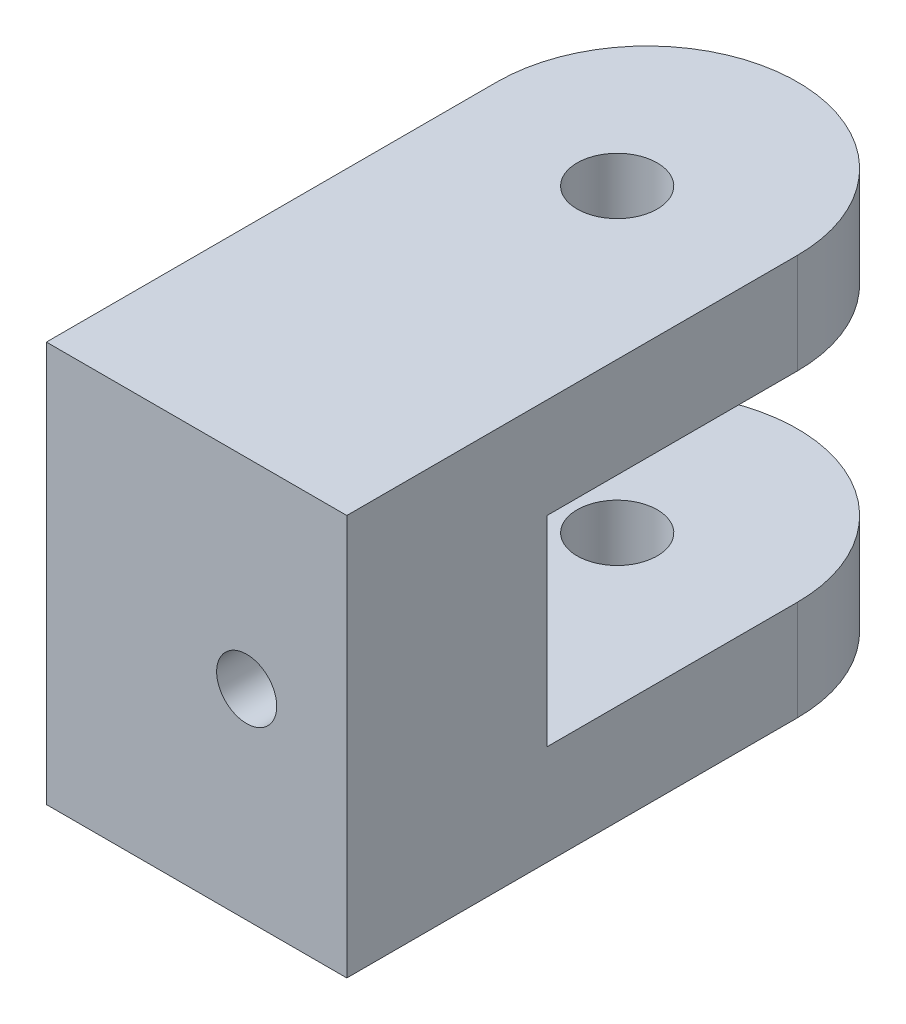
ISO-10303-21;
HEADER;
FILE_DESCRIPTION(('STEP AP214'),'2;1');
FILE_NAME('part.step','',(''),(''),'','','');
FILE_SCHEMA(('AUTOMOTIVE_DESIGN { 1 0 10303 214 1 1 1 1 }'));
ENDSEC;
DATA;
#1=APPLICATION_CONTEXT('core data for automotive mechanical design processes');
#2=APPLICATION_PROTOCOL_DEFINITION('international standard','automotive_design',2000,#1);
#3=PRODUCT_CONTEXT('',#1,'mechanical');
#4=PRODUCT('Part','Part','',(#3));
#5=PRODUCT_RELATED_PRODUCT_CATEGORY('part','',(#4));
#6=PRODUCT_DEFINITION_FORMATION('','',#4);
#7=PRODUCT_DEFINITION_CONTEXT('part definition',#1,'design');
#8=PRODUCT_DEFINITION('design','',#6,#7);
#9=PRODUCT_DEFINITION_SHAPE('','',#8);
#10=(LENGTH_UNIT() NAMED_UNIT(*) SI_UNIT(.MILLI.,.METRE.));
#11=(NAMED_UNIT(*) PLANE_ANGLE_UNIT() SI_UNIT($,.RADIAN.));
#12=(NAMED_UNIT(*) SI_UNIT($,.STERADIAN.) SOLID_ANGLE_UNIT());
#13=UNCERTAINTY_MEASURE_WITH_UNIT(LENGTH_MEASURE(1.E-05),#10,'distance_accuracy_value','');
#14=(GEOMETRIC_REPRESENTATION_CONTEXT(3) GLOBAL_UNCERTAINTY_ASSIGNED_CONTEXT((#13)) GLOBAL_UNIT_ASSIGNED_CONTEXT((#10,
#11,#12)) REPRESENTATION_CONTEXT('',''));
#15=CARTESIAN_POINT('',(0.,0.,0.));
#16=DIRECTION('',(0.,0.,1.));
#17=DIRECTION('',(1.,0.,0.));
#18=AXIS2_PLACEMENT_3D('',#15,#16,#17);
#19=CARTESIAN_POINT('',(7.5,0.,-12.5));
#20=DIRECTION('',(0.,-1.,0.));
#21=DIRECTION('',(0.,0.,-1.));
#22=AXIS2_PLACEMENT_3D('',#19,#20,#21);
#23=CYLINDRICAL_SURFACE('',#22,7.5);
#24=DIRECTION('',(0.,1.,0.));
#25=VECTOR('',#24,1.);
#26=CARTESIAN_POINT('',(15.,0.,-12.5));
#27=LINE('',#26,#25);
#28=CARTESIAN_POINT('',(15.,0.,-12.5));
#29=VERTEX_POINT('',#28);
#30=CARTESIAN_POINT('',(15.,5.,-12.5));
#31=VERTEX_POINT('',#30);
#32=EDGE_CURVE('E184',#29,#31,#27,.T.);
#33=ORIENTED_EDGE('',*,*,#32,.F.);
#34=CARTESIAN_POINT('',(7.5,0.,-12.5));
#35=DIRECTION('',(0.,1.,0.));
#36=DIRECTION('',(0.,0.,1.));
#37=AXIS2_PLACEMENT_3D('',#34,#35,#36);
#38=CIRCLE('',#37,7.5);
#39=CARTESIAN_POINT('',(0.,0.,-12.5));
#40=VERTEX_POINT('',#39);
#41=EDGE_CURVE('E53',#40,#29,#38,.F.);
#42=ORIENTED_EDGE('',*,*,#41,.F.);
#43=DIRECTION('',(0.,1.,0.));
#44=VECTOR('',#43,1.);
#45=CARTESIAN_POINT('',(0.,0.,-12.5));
#46=LINE('',#45,#44);
#47=CARTESIAN_POINT('',(0.,5.,-12.5));
#48=VERTEX_POINT('',#47);
#49=EDGE_CURVE('E187',#48,#40,#46,.F.);
#50=ORIENTED_EDGE('',*,*,#49,.F.);
#51=CARTESIAN_POINT('',(7.5,5.,-12.5));
#52=DIRECTION('',(0.,-1.,0.));
#53=DIRECTION('',(0.,0.,-1.));
#54=AXIS2_PLACEMENT_3D('',#51,#52,#53);
#55=CIRCLE('',#54,7.5);
#56=EDGE_CURVE('E11',#31,#48,#55,.F.);
#57=ORIENTED_EDGE('',*,*,#56,.F.);
#58=EDGE_LOOP('',(#33,#42,#50,#57));
#59=FACE_BOUND('',#58,.T.);
#60=ADVANCED_FACE('F44',(#59),#23,.T.);
#61=CARTESIAN_POINT('',(7.5,15.,-12.5));
#62=DIRECTION('',(0.,-1.,0.));
#63=DIRECTION('',(0.,0.,-1.));
#64=AXIS2_PLACEMENT_3D('',#61,#62,#63);
#65=CYLINDRICAL_SURFACE('',#64,7.5);
#66=DIRECTION('',(0.,1.,0.));
#67=VECTOR('',#66,1.);
#68=CARTESIAN_POINT('',(15.,15.,-12.5));
#69=LINE('',#68,#67);
#70=CARTESIAN_POINT('',(15.,15.,-12.5));
#71=VERTEX_POINT('',#70);
#72=CARTESIAN_POINT('',(15.,20.,-12.5));
#73=VERTEX_POINT('',#72);
#74=EDGE_CURVE('E172',#71,#73,#69,.T.);
#75=ORIENTED_EDGE('',*,*,#74,.F.);
#76=CARTESIAN_POINT('',(7.5,15.,-12.5));
#77=DIRECTION('',(0.,1.,0.));
#78=DIRECTION('',(0.,0.,1.));
#79=AXIS2_PLACEMENT_3D('',#76,#77,#78);
#80=CIRCLE('',#79,7.5);
#81=CARTESIAN_POINT('',(0.,15.,-12.5));
#82=VERTEX_POINT('',#81);
#83=EDGE_CURVE('E176',#82,#71,#80,.F.);
#84=ORIENTED_EDGE('',*,*,#83,.F.);
#85=DIRECTION('',(0.,1.,0.));
#86=VECTOR('',#85,1.);
#87=CARTESIAN_POINT('',(0.,15.,-12.5));
#88=LINE('',#87,#86);
#89=CARTESIAN_POINT('',(0.,20.,-12.5));
#90=VERTEX_POINT('',#89);
#91=EDGE_CURVE('E119',#90,#82,#88,.F.);
#92=ORIENTED_EDGE('',*,*,#91,.F.);
#93=CARTESIAN_POINT('',(7.5,20.,-12.5));
#94=DIRECTION('',(0.,-1.,0.));
#95=DIRECTION('',(0.,0.,-1.));
#96=AXIS2_PLACEMENT_3D('',#93,#94,#95);
#97=CIRCLE('',#96,7.5);
#98=EDGE_CURVE('E185',#73,#90,#97,.F.);
#99=ORIENTED_EDGE('',*,*,#98,.F.);
#100=EDGE_LOOP('',(#75,#84,#92,#99));
#101=FACE_BOUND('',#100,.T.);
#102=ADVANCED_FACE('F211',(#101),#65,.T.);
#103=CARTESIAN_POINT('',(15.,0.,10.));
#104=DIRECTION('',(-1.,0.,0.));
#105=DIRECTION('',(0.,0.,1.));
#106=AXIS2_PLACEMENT_3D('',#103,#104,#105);
#107=PLANE('',#106);
#108=DIRECTION('',(0.,0.,-1.));
#109=VECTOR('',#108,1.);
#110=CARTESIAN_POINT('',(15.,0.,10.));
#111=LINE('',#110,#109);
#112=CARTESIAN_POINT('',(15.,0.,10.));
#113=VERTEX_POINT('',#112);
#114=EDGE_CURVE('E167',#113,#29,#111,.T.);
#115=ORIENTED_EDGE('',*,*,#114,.T.);
#116=ORIENTED_EDGE('',*,*,#32,.T.);
#117=DIRECTION('',(0.,0.,-1.));
#118=VECTOR('',#117,1.);
#119=CARTESIAN_POINT('',(15.,5.,-20.));
#120=LINE('',#119,#118);
#121=CARTESIAN_POINT('',(15.,5.,0.));
#122=VERTEX_POINT('',#121);
#123=EDGE_CURVE('E120',#122,#31,#120,.T.);
#124=ORIENTED_EDGE('',*,*,#123,.F.);
#125=DIRECTION('',(0.,-1.,0.));
#126=VECTOR('',#125,1.);
#127=CARTESIAN_POINT('',(15.,15.,0.));
#128=LINE('',#127,#126);
#129=CARTESIAN_POINT('',(15.,15.,0.));
#130=VERTEX_POINT('',#129);
#131=EDGE_CURVE('E136',#130,#122,#128,.T.);
#132=ORIENTED_EDGE('',*,*,#131,.F.);
#133=DIRECTION('',(0.,0.,1.));
#134=VECTOR('',#133,1.);
#135=CARTESIAN_POINT('',(15.,15.,-20.));
#136=LINE('',#135,#134);
#137=EDGE_CURVE('E130',#71,#130,#136,.T.);
#138=ORIENTED_EDGE('',*,*,#137,.F.);
#139=ORIENTED_EDGE('',*,*,#74,.T.);
#140=DIRECTION('',(0.,0.,-1.));
#141=VECTOR('',#140,1.);
#142=CARTESIAN_POINT('',(15.,20.,10.));
#143=LINE('',#142,#141);
#144=CARTESIAN_POINT('',(15.,20.,10.));
#145=VERTEX_POINT('',#144);
#146=EDGE_CURVE('E162',#145,#73,#143,.T.);
#147=ORIENTED_EDGE('',*,*,#146,.F.);
#148=DIRECTION('',(0.,1.,0.));
#149=VECTOR('',#148,1.);
#150=CARTESIAN_POINT('',(15.,0.,10.));
#151=LINE('',#150,#149);
#152=EDGE_CURVE('E160',#113,#145,#151,.T.);
#153=ORIENTED_EDGE('',*,*,#152,.F.);
#154=EDGE_LOOP('',(#115,#116,#124,#132,#138,#139,#147,#153));
#155=FACE_BOUND('',#154,.T.);
#156=ADVANCED_FACE('F197',(#155),#107,.F.);
#157=CARTESIAN_POINT('',(7.5,45.,-11.));
#158=DIRECTION('',(0.,-1.,0.));
#159=DIRECTION('',(0.,0.,-1.));
#160=AXIS2_PLACEMENT_3D('',#157,#158,#159);
#161=CYLINDRICAL_SURFACE('',#160,2.);
#162=CARTESIAN_POINT('',(7.5,5.,-11.));
#163=DIRECTION('',(0.,-1.,0.));
#164=DIRECTION('',(0.,0.,-1.));
#165=AXIS2_PLACEMENT_3D('',#162,#163,#164);
#166=CIRCLE('',#165,2.);
#167=CARTESIAN_POINT('',(7.5,5.00000000000001,-13.));
#168=VERTEX_POINT('',#167);
#169=EDGE_CURVE('E149',#168,#168,#166,.F.);
#170=CARTESIAN_POINT('',(7.5,0.,-11.));
#171=DIRECTION('',(0.,-1.,0.));
#172=DIRECTION('',(0.,0.,-1.));
#173=AXIS2_PLACEMENT_3D('',#170,#171,#172);
#174=CIRCLE('',#173,2.);
#175=CARTESIAN_POINT('',(7.5,0.,-13.));
#176=VERTEX_POINT('',#175);
#177=EDGE_CURVE('E144',#176,#176,#174,.T.);
#178=CARTESIAN_POINT('',(7.5,5.00000000000001,-13.));
#179=CARTESIAN_POINT('',(7.5,4.94791666666668,-13.));
#180=CARTESIAN_POINT('',(7.5,4.89583333333335,-13.));
#181=CARTESIAN_POINT('',(7.5,4.79166666666668,-13.));
#182=CARTESIAN_POINT('',(7.5,4.73958333333335,-13.));
#183=CARTESIAN_POINT('',(7.5,4.63541666666668,-13.));
#184=CARTESIAN_POINT('',(7.5,4.58333333333334,-13.));
#185=CARTESIAN_POINT('',(7.5,4.47916666666668,-13.));
#186=CARTESIAN_POINT('',(7.5,4.42708333333334,-13.));
#187=CARTESIAN_POINT('',(7.5,4.32291666666668,-13.));
#188=CARTESIAN_POINT('',(7.5,4.27083333333335,-13.));
#189=CARTESIAN_POINT('',(7.5,4.16666666666668,-13.));
#190=CARTESIAN_POINT('',(7.5,4.11458333333335,-13.));
#191=CARTESIAN_POINT('',(7.5,4.01041666666668,-13.));
#192=CARTESIAN_POINT('',(7.5,3.95833333333334,-13.));
#193=CARTESIAN_POINT('',(7.5,3.85416666666667,-13.));
#194=CARTESIAN_POINT('',(7.5,3.80208333333334,-13.));
#195=CARTESIAN_POINT('',(7.5,3.69791666666668,-13.));
#196=CARTESIAN_POINT('',(7.5,3.64583333333335,-13.));
#197=CARTESIAN_POINT('',(7.5,3.54166666666668,-13.));
#198=CARTESIAN_POINT('',(7.5,3.48958333333334,-13.));
#199=CARTESIAN_POINT('',(7.5,3.38541666666668,-13.));
#200=CARTESIAN_POINT('',(7.5,3.33333333333334,-13.));
#201=CARTESIAN_POINT('',(7.5,3.22916666666667,-13.));
#202=CARTESIAN_POINT('',(7.5,3.17708333333334,-13.));
#203=CARTESIAN_POINT('',(7.5,3.07291666666668,-13.));
#204=CARTESIAN_POINT('',(7.5,3.02083333333335,-13.));
#205=CARTESIAN_POINT('',(7.5,2.91666666666668,-13.));
#206=CARTESIAN_POINT('',(7.5,2.86458333333334,-13.));
#207=CARTESIAN_POINT('',(7.5,2.76041666666667,-13.));
#208=CARTESIAN_POINT('',(7.5,2.70833333333334,-13.));
#209=CARTESIAN_POINT('',(7.5,2.60416666666667,-13.));
#210=CARTESIAN_POINT('',(7.5,2.55208333333334,-13.));
#211=CARTESIAN_POINT('',(7.5,2.44791666666668,-13.));
#212=CARTESIAN_POINT('',(7.5,2.39583333333335,-13.));
#213=CARTESIAN_POINT('',(7.5,2.29166666666668,-13.));
#214=CARTESIAN_POINT('',(7.5,2.23958333333334,-13.));
#215=CARTESIAN_POINT('',(7.5,2.13541666666667,-13.));
#216=CARTESIAN_POINT('',(7.5,2.08333333333334,-13.));
#217=CARTESIAN_POINT('',(7.5,1.97916666666667,-13.));
#218=CARTESIAN_POINT('',(7.5,1.92708333333334,-13.));
#219=CARTESIAN_POINT('',(7.5,1.82291666666668,-13.));
#220=CARTESIAN_POINT('',(7.5,1.77083333333334,-13.));
#221=CARTESIAN_POINT('',(7.5,1.66666666666668,-13.));
#222=CARTESIAN_POINT('',(7.5,1.61458333333334,-13.));
#223=CARTESIAN_POINT('',(7.5,1.51041666666667,-13.));
#224=CARTESIAN_POINT('',(7.5,1.45833333333334,-13.));
#225=CARTESIAN_POINT('',(7.5,1.35416666666667,-13.));
#226=CARTESIAN_POINT('',(7.5,1.30208333333334,-13.));
#227=CARTESIAN_POINT('',(7.5,1.19791666666668,-13.));
#228=CARTESIAN_POINT('',(7.5,1.14583333333334,-13.));
#229=CARTESIAN_POINT('',(7.5,1.04166666666668,-13.));
#230=CARTESIAN_POINT('',(7.5,0.989583333333342,-13.));
#231=CARTESIAN_POINT('',(7.5,0.885416666666673,-13.));
#232=CARTESIAN_POINT('',(7.5,0.833333333333339,-13.));
#233=CARTESIAN_POINT('',(7.5,0.729166666666672,-13.));
#234=CARTESIAN_POINT('',(7.5,0.67708333333334,-13.));
#235=CARTESIAN_POINT('',(7.5,0.572916666666675,-13.));
#236=CARTESIAN_POINT('',(7.5,0.520833333333343,-13.));
#237=CARTESIAN_POINT('',(7.5,0.416666666666676,-13.));
#238=CARTESIAN_POINT('',(7.5,0.364583333333342,-13.));
#239=CARTESIAN_POINT('',(7.5,0.260416666666673,-13.));
#240=CARTESIAN_POINT('',(7.5,0.208333333333338,-13.));
#241=CARTESIAN_POINT('',(7.5,0.104166666666671,-13.));
#242=CARTESIAN_POINT('',(7.5,0.0520833333333391,-13.));
#243=CARTESIAN_POINT('',(7.5,0.,-13.));
#244=B_SPLINE_CURVE_WITH_KNOTS('',3,(#178,#179,#180,#181,#182,#183,#184,#185,#186,#187,#188,
#189,#190,#191,#192,#193,#194,#195,#196,#197,#198,#199,#200,#201,#202,#203,#204,#205,#206,#207,
#208,#209,#210,#211,#212,#213,#214,#215,#216,#217,#218,#219,#220,#221,#222,#223,#224,#225,#226,
#227,#228,#229,#230,#231,#232,#233,#234,#235,#236,#237,#238,#239,#240,#241,#242,#243),
.UNSPECIFIED.,.F.,.F.,(4,2,2,2,2,2,2,2,2,2,2,2,2,2,2,2,2,2,2,2,2,2,2,2,2,2,2,2,2,2,2,2,4),(0.,
0.156249999999997,0.3125,0.468750000000004,0.625000000000001,0.781249999999997,
0.937500000000001,1.09375,1.25,1.40625,1.5625,1.71875,1.875,2.03125,2.1875,2.34375000000001,2.5,
2.65625,2.8125,2.96875000000001,3.125,3.28125,3.4375,3.59375000000001,3.75,3.90625,4.0625,
4.21875000000001,4.375,4.53125,4.6875,4.84375000000001,5.),.UNSPECIFIED.);
#245=EDGE_CURVE('BSEAM217',#168,#176,#244,.T.);
#246=ORIENTED_EDGE('',*,*,#169,.T.);
#247=ORIENTED_EDGE('',*,*,#177,.T.);
#248=ORIENTED_EDGE('',*,*,#245,.T.);
#249=ORIENTED_EDGE('',*,*,#245,.F.);
#250=EDGE_LOOP('',(#246,#248,#247,#249));
#251=FACE_BOUND('',#250,.T.);
#252=ADVANCED_FACE('F217',(#251),#161,.F.);
#253=CARTESIAN_POINT('',(0.,0.,10.));
#254=DIRECTION('',(1.,0.,0.));
#255=DIRECTION('',(0.,0.,-1.));
#256=AXIS2_PLACEMENT_3D('',#253,#254,#255);
#257=PLANE('',#256);
#258=DIRECTION('',(0.,0.,-1.));
#259=VECTOR('',#258,1.);
#260=CARTESIAN_POINT('',(0.,5.,-20.));
#261=LINE('',#260,#259);
#262=CARTESIAN_POINT('',(0.,5.,0.));
#263=VERTEX_POINT('',#262);
#264=EDGE_CURVE('E132',#263,#48,#261,.T.);
#265=ORIENTED_EDGE('',*,*,#264,.T.);
#266=ORIENTED_EDGE('',*,*,#49,.T.);
#267=DIRECTION('',(0.,0.,-1.));
#268=VECTOR('',#267,1.);
#269=CARTESIAN_POINT('',(0.,0.,10.));
#270=LINE('',#269,#268);
#271=CARTESIAN_POINT('',(0.,0.,10.));
#272=VERTEX_POINT('',#271);
#273=EDGE_CURVE('E166',#272,#40,#270,.T.);
#274=ORIENTED_EDGE('',*,*,#273,.F.);
#275=DIRECTION('',(0.,-1.,0.));
#276=VECTOR('',#275,1.);
#277=CARTESIAN_POINT('',(0.,0.,10.));
#278=LINE('',#277,#276);
#279=CARTESIAN_POINT('',(0.,20.,10.));
#280=VERTEX_POINT('',#279);
#281=EDGE_CURVE('E155',#280,#272,#278,.T.);
#282=ORIENTED_EDGE('',*,*,#281,.F.);
#283=DIRECTION('',(0.,0.,-1.));
#284=VECTOR('',#283,1.);
#285=CARTESIAN_POINT('',(0.,20.,10.));
#286=LINE('',#285,#284);
#287=EDGE_CURVE('E161',#280,#90,#286,.T.);
#288=ORIENTED_EDGE('',*,*,#287,.T.);
#289=ORIENTED_EDGE('',*,*,#91,.T.);
#290=DIRECTION('',(0.,0.,1.));
#291=VECTOR('',#290,1.);
#292=CARTESIAN_POINT('',(0.,15.,-20.));
#293=LINE('',#292,#291);
#294=CARTESIAN_POINT('',(0.,15.,0.));
#295=VERTEX_POINT('',#294);
#296=EDGE_CURVE('E109',#82,#295,#293,.T.);
#297=ORIENTED_EDGE('',*,*,#296,.T.);
#298=DIRECTION('',(0.,-1.,0.));
#299=VECTOR('',#298,1.);
#300=CARTESIAN_POINT('',(0.,15.,0.));
#301=LINE('',#300,#299);
#302=EDGE_CURVE('E113',#295,#263,#301,.T.);
#303=ORIENTED_EDGE('',*,*,#302,.T.);
#304=EDGE_LOOP('',(#265,#266,#274,#282,#288,#289,#297,#303));
#305=FACE_BOUND('',#304,.T.);
#306=ADVANCED_FACE('F114',(#305),#257,.F.);
#307=CARTESIAN_POINT('',(0.,0.,10.));
#308=DIRECTION('',(0.,1.,0.));
#309=DIRECTION('',(0.,0.,1.));
#310=AXIS2_PLACEMENT_3D('',#307,#308,#309);
#311=PLANE('',#310);
#312=ORIENTED_EDGE('',*,*,#273,.T.);
#313=ORIENTED_EDGE('',*,*,#41,.T.);
#314=ORIENTED_EDGE('',*,*,#114,.F.);
#315=DIRECTION('',(1.,0.,0.));
#316=VECTOR('',#315,1.);
#317=CARTESIAN_POINT('',(0.,0.,10.));
#318=LINE('',#317,#316);
#319=EDGE_CURVE('E154',#272,#113,#318,.T.);
#320=ORIENTED_EDGE('',*,*,#319,.F.);
#321=EDGE_LOOP('',(#312,#313,#314,#320));
#322=FACE_BOUND('',#321,.T.);
#323=ORIENTED_EDGE('',*,*,#177,.F.);
#324=EDGE_LOOP('',(#323));
#325=FACE_BOUND('',#324,.T.);
#326=ADVANCED_FACE('F193',(#322,#325),#311,.F.);
#327=CARTESIAN_POINT('',(0.,20.,10.));
#328=DIRECTION('',(0.,-1.,0.));
#329=DIRECTION('',(0.,0.,-1.));
#330=AXIS2_PLACEMENT_3D('',#327,#328,#329);
#331=PLANE('',#330);
#332=ORIENTED_EDGE('',*,*,#146,.T.);
#333=ORIENTED_EDGE('',*,*,#98,.T.);
#334=ORIENTED_EDGE('',*,*,#287,.F.);
#335=DIRECTION('',(-1.,0.,0.));
#336=VECTOR('',#335,1.);
#337=CARTESIAN_POINT('',(0.,20.,10.));
#338=LINE('',#337,#336);
#339=EDGE_CURVE('E157',#145,#280,#338,.T.);
#340=ORIENTED_EDGE('',*,*,#339,.F.);
#341=EDGE_LOOP('',(#332,#333,#334,#340));
#342=FACE_BOUND('',#341,.T.);
#343=CARTESIAN_POINT('',(7.5,20.,-11.));
#344=DIRECTION('',(0.,-1.,0.));
#345=DIRECTION('',(0.,0.,-1.));
#346=AXIS2_PLACEMENT_3D('',#343,#344,#345);
#347=CIRCLE('',#346,2.);
#348=CARTESIAN_POINT('',(7.5,20.,-13.));
#349=VERTEX_POINT('',#348);
#350=EDGE_CURVE('E146',#349,#349,#347,.F.);
#351=ORIENTED_EDGE('',*,*,#350,.F.);
#352=EDGE_LOOP('',(#351));
#353=FACE_BOUND('',#352,.T.);
#354=ADVANCED_FACE('F207',(#342,#353),#331,.F.);
#355=CARTESIAN_POINT('',(0.,0.,10.));
#356=DIRECTION('',(0.,0.,-1.));
#357=DIRECTION('',(-1.,0.,0.));
#358=AXIS2_PLACEMENT_3D('',#355,#356,#357);
#359=PLANE('',#358);
#360=CARTESIAN_POINT('',(10.,10.,10.));
#361=DIRECTION('',(0.,0.,1.));
#362=DIRECTION('',(1.,0.,0.));
#363=AXIS2_PLACEMENT_3D('',#360,#361,#362);
#364=CIRCLE('',#363,1.5);
#365=CARTESIAN_POINT('',(11.5,10.,10.));
#366=VERTEX_POINT('',#365);
#367=EDGE_CURVE('E253',#366,#366,#364,.T.);
#368=ORIENTED_EDGE('',*,*,#367,.F.);
#369=EDGE_LOOP('',(#368));
#370=FACE_BOUND('',#369,.T.);
#371=ORIENTED_EDGE('',*,*,#281,.T.);
#372=ORIENTED_EDGE('',*,*,#319,.T.);
#373=ORIENTED_EDGE('',*,*,#152,.T.);
#374=ORIENTED_EDGE('',*,*,#339,.T.);
#375=EDGE_LOOP('',(#371,#372,#373,#374));
#376=FACE_BOUND('',#375,.T.);
#377=ADVANCED_FACE('F203',(#370,#376),#359,.F.);
#378=CARTESIAN_POINT('',(7.5,15.,-11.));
#379=DIRECTION('',(0.,1.,0.));
#380=DIRECTION('',(0.,0.,1.));
#381=AXIS2_PLACEMENT_3D('',#378,#379,#380);
#382=CIRCLE('',#381,2.);
#383=CARTESIAN_POINT('',(7.5,15.,-13.));
#384=VERTEX_POINT('',#383);
#385=EDGE_CURVE('E141',#384,#384,#382,.F.);
#386=CARTESIAN_POINT('',(7.5,15.,-13.));
#387=CARTESIAN_POINT('',(7.5,15.0520833333333,-13.));
#388=CARTESIAN_POINT('',(7.5,15.1041666666667,-13.));
#389=CARTESIAN_POINT('',(7.5,15.2083333333333,-13.));
#390=CARTESIAN_POINT('',(7.5,15.2604166666667,-13.));
#391=CARTESIAN_POINT('',(7.5,15.3645833333333,-13.));
#392=CARTESIAN_POINT('',(7.5,15.4166666666667,-13.));
#393=CARTESIAN_POINT('',(7.5,15.5208333333333,-13.));
#394=CARTESIAN_POINT('',(7.5,15.5729166666667,-13.));
#395=CARTESIAN_POINT('',(7.5,15.6770833333333,-13.));
#396=CARTESIAN_POINT('',(7.5,15.7291666666667,-13.));
#397=CARTESIAN_POINT('',(7.5,15.8333333333333,-13.));
#398=CARTESIAN_POINT('',(7.5,15.8854166666667,-13.));
#399=CARTESIAN_POINT('',(7.5,15.9895833333333,-13.));
#400=CARTESIAN_POINT('',(7.5,16.0416666666667,-13.));
#401=CARTESIAN_POINT('',(7.5,16.1458333333333,-13.));
#402=CARTESIAN_POINT('',(7.5,16.1979166666667,-13.));
#403=CARTESIAN_POINT('',(7.5,16.3020833333333,-13.));
#404=CARTESIAN_POINT('',(7.5,16.3541666666667,-13.));
#405=CARTESIAN_POINT('',(7.5,16.4583333333333,-13.));
#406=CARTESIAN_POINT('',(7.5,16.5104166666667,-13.));
#407=CARTESIAN_POINT('',(7.5,16.6145833333333,-13.));
#408=CARTESIAN_POINT('',(7.5,16.6666666666667,-13.));
#409=CARTESIAN_POINT('',(7.5,16.7708333333333,-13.));
#410=CARTESIAN_POINT('',(7.5,16.8229166666667,-13.));
#411=CARTESIAN_POINT('',(7.5,16.9270833333333,-13.));
#412=CARTESIAN_POINT('',(7.5,16.9791666666667,-13.));
#413=CARTESIAN_POINT('',(7.5,17.0833333333333,-13.));
#414=CARTESIAN_POINT('',(7.5,17.1354166666667,-13.));
#415=CARTESIAN_POINT('',(7.5,17.2395833333333,-13.));
#416=CARTESIAN_POINT('',(7.5,17.2916666666667,-13.));
#417=CARTESIAN_POINT('',(7.5,17.3958333333333,-13.));
#418=CARTESIAN_POINT('',(7.5,17.4479166666667,-13.));
#419=CARTESIAN_POINT('',(7.5,17.5520833333333,-13.));
#420=CARTESIAN_POINT('',(7.5,17.6041666666667,-13.));
#421=CARTESIAN_POINT('',(7.5,17.7083333333333,-13.));
#422=CARTESIAN_POINT('',(7.5,17.7604166666667,-13.));
#423=CARTESIAN_POINT('',(7.5,17.8645833333333,-13.));
#424=CARTESIAN_POINT('',(7.5,17.9166666666667,-13.));
#425=CARTESIAN_POINT('',(7.5,18.0208333333333,-13.));
#426=CARTESIAN_POINT('',(7.5,18.0729166666667,-13.));
#427=CARTESIAN_POINT('',(7.5,18.1770833333333,-13.));
#428=CARTESIAN_POINT('',(7.5,18.2291666666667,-13.));
#429=CARTESIAN_POINT('',(7.5,18.3333333333333,-13.));
#430=CARTESIAN_POINT('',(7.5,18.3854166666667,-13.));
#431=CARTESIAN_POINT('',(7.5,18.4895833333333,-13.));
#432=CARTESIAN_POINT('',(7.5,18.5416666666667,-13.));
#433=CARTESIAN_POINT('',(7.5,18.6458333333333,-13.));
#434=CARTESIAN_POINT('',(7.5,18.6979166666667,-13.));
#435=CARTESIAN_POINT('',(7.5,18.8020833333333,-13.));
#436=CARTESIAN_POINT('',(7.5,18.8541666666667,-13.));
#437=CARTESIAN_POINT('',(7.5,18.9583333333333,-13.));
#438=CARTESIAN_POINT('',(7.5,19.0104166666667,-13.));
#439=CARTESIAN_POINT('',(7.5,19.1145833333333,-13.));
#440=CARTESIAN_POINT('',(7.5,19.1666666666667,-13.));
#441=CARTESIAN_POINT('',(7.5,19.2708333333333,-13.));
#442=CARTESIAN_POINT('',(7.5,19.3229166666667,-13.));
#443=CARTESIAN_POINT('',(7.5,19.4270833333333,-13.));
#444=CARTESIAN_POINT('',(7.5,19.4791666666667,-13.));
#445=CARTESIAN_POINT('',(7.5,19.5833333333333,-13.));
#446=CARTESIAN_POINT('',(7.5,19.6354166666667,-13.));
#447=CARTESIAN_POINT('',(7.5,19.7395833333333,-13.));
#448=CARTESIAN_POINT('',(7.5,19.7916666666667,-13.));
#449=CARTESIAN_POINT('',(7.5,19.8958333333333,-13.));
#450=CARTESIAN_POINT('',(7.5,19.9479166666667,-13.));
#451=CARTESIAN_POINT('',(7.5,20.,-13.));
#452=B_SPLINE_CURVE_WITH_KNOTS('',3,(#386,#387,#388,#389,#390,#391,#392,#393,#394,#395,#396,
#397,#398,#399,#400,#401,#402,#403,#404,#405,#406,#407,#408,#409,#410,#411,#412,#413,#414,#415,
#416,#417,#418,#419,#420,#421,#422,#423,#424,#425,#426,#427,#428,#429,#430,#431,#432,#433,#434,
#435,#436,#437,#438,#439,#440,#441,#442,#443,#444,#445,#446,#447,#448,#449,#450,#451),
.UNSPECIFIED.,.F.,.F.,(4,2,2,2,2,2,2,2,2,2,2,2,2,2,2,2,2,2,2,2,2,2,2,2,2,2,2,2,2,2,2,2,4),(0.,
0.15625,0.3125,0.46875,0.625000000000001,0.781250000000001,0.937500000000001,1.09375,1.25,
1.40625,1.5625,1.71875,1.875,2.03125,2.1875,2.34375,2.5,2.65625,2.8125,2.96875,3.125,3.28125,
3.4375,3.59375,3.75,3.90625,4.0625,4.21875,4.375,4.53125,4.6875,4.84375,5.),.UNSPECIFIED.);
#453=EDGE_CURVE('BSEAM234',#384,#349,#452,.T.);
#454=ORIENTED_EDGE('',*,*,#385,.T.);
#455=ORIENTED_EDGE('',*,*,#350,.T.);
#456=ORIENTED_EDGE('',*,*,#453,.T.);
#457=ORIENTED_EDGE('',*,*,#453,.F.);
#458=EDGE_LOOP('',(#454,#456,#455,#457));
#459=FACE_BOUND('',#458,.T.);
#460=ADVANCED_FACE('F234',(#459),#161,.F.);
#461=CARTESIAN_POINT('',(0.,5.,-20.));
#462=DIRECTION('',(0.,-1.,0.));
#463=DIRECTION('',(0.,0.,-1.));
#464=AXIS2_PLACEMENT_3D('',#461,#462,#463);
#465=PLANE('',#464);
#466=ORIENTED_EDGE('',*,*,#123,.T.);
#467=ORIENTED_EDGE('',*,*,#56,.T.);
#468=ORIENTED_EDGE('',*,*,#264,.F.);
#469=DIRECTION('',(1.,0.,0.));
#470=VECTOR('',#469,1.);
#471=CARTESIAN_POINT('',(0.,5.,0.));
#472=LINE('',#471,#470);
#473=EDGE_CURVE('E131',#263,#122,#472,.T.);
#474=ORIENTED_EDGE('',*,*,#473,.T.);
#475=EDGE_LOOP('',(#466,#467,#468,#474));
#476=FACE_BOUND('',#475,.T.);
#477=ORIENTED_EDGE('',*,*,#169,.F.);
#478=EDGE_LOOP('',(#477));
#479=FACE_BOUND('',#478,.T.);
#480=ADVANCED_FACE('F204',(#476,#479),#465,.F.);
#481=CARTESIAN_POINT('',(0.,15.,-20.));
#482=DIRECTION('',(0.,1.,0.));
#483=DIRECTION('',(0.,0.,1.));
#484=AXIS2_PLACEMENT_3D('',#481,#482,#483);
#485=PLANE('',#484);
#486=ORIENTED_EDGE('',*,*,#296,.F.);
#487=ORIENTED_EDGE('',*,*,#83,.T.);
#488=ORIENTED_EDGE('',*,*,#137,.T.);
#489=DIRECTION('',(1.,0.,0.));
#490=VECTOR('',#489,1.);
#491=CARTESIAN_POINT('',(0.,15.,0.));
#492=LINE('',#491,#490);
#493=EDGE_CURVE('E122',#295,#130,#492,.T.);
#494=ORIENTED_EDGE('',*,*,#493,.F.);
#495=EDGE_LOOP('',(#486,#487,#488,#494));
#496=FACE_BOUND('',#495,.T.);
#497=ORIENTED_EDGE('',*,*,#385,.F.);
#498=EDGE_LOOP('',(#497));
#499=FACE_BOUND('',#498,.T.);
#500=ADVANCED_FACE('F125',(#496,#499),#485,.F.);
#501=CARTESIAN_POINT('',(0.,15.,0.));
#502=DIRECTION('',(0.,0.,1.));
#503=DIRECTION('',(0.,-1.,0.));
#504=AXIS2_PLACEMENT_3D('',#501,#502,#503);
#505=PLANE('',#504);
#506=CARTESIAN_POINT('',(10.,10.,0.));
#507=DIRECTION('',(0.,0.,1.));
#508=DIRECTION('',(0.,-1.,0.));
#509=AXIS2_PLACEMENT_3D('',#506,#507,#508);
#510=CIRCLE('',#509,1.5);
#511=CARTESIAN_POINT('',(10.,8.5,0.));
#512=VERTEX_POINT('',#511);
#513=EDGE_CURVE('E47',#512,#512,#510,.T.);
#514=ORIENTED_EDGE('',*,*,#513,.T.);
#515=EDGE_LOOP('',(#514));
#516=FACE_BOUND('',#515,.T.);
#517=ORIENTED_EDGE('',*,*,#131,.T.);
#518=ORIENTED_EDGE('',*,*,#473,.F.);
#519=ORIENTED_EDGE('',*,*,#302,.F.);
#520=ORIENTED_EDGE('',*,*,#493,.T.);
#521=EDGE_LOOP('',(#517,#518,#519,#520));
#522=FACE_BOUND('',#521,.T.);
#523=ADVANCED_FACE('F133',(#516,#522),#505,.F.);
#524=CARTESIAN_POINT('',(10.,10.,-20.));
#525=DIRECTION('',(0.,0.,1.));
#526=DIRECTION('',(1.,0.,0.));
#527=AXIS2_PLACEMENT_3D('',#524,#525,#526);
#528=CYLINDRICAL_SURFACE('',#527,1.5);
#529=ORIENTED_EDGE('',*,*,#367,.T.);
#530=EDGE_LOOP('',(#529));
#531=FACE_BOUND('',#530,.T.);
#532=ORIENTED_EDGE('',*,*,#513,.F.);
#533=EDGE_LOOP('',(#532));
#534=FACE_BOUND('',#533,.T.);
#535=ADVANCED_FACE('F238',(#531,#534),#528,.F.);
#536=CLOSED_SHELL('',(#60,#102,#156,#252,#306,#326,#354,#377,#460,#480,#500,#523,#535));
#537=MANIFOLD_SOLID_BREP('B2',#536);
#538=ADVANCED_BREP_SHAPE_REPRESENTATION('',(#18,#537),#14);
#539=SHAPE_DEFINITION_REPRESENTATION(#9,#538);
ENDSEC;
END-ISO-10303-21;
